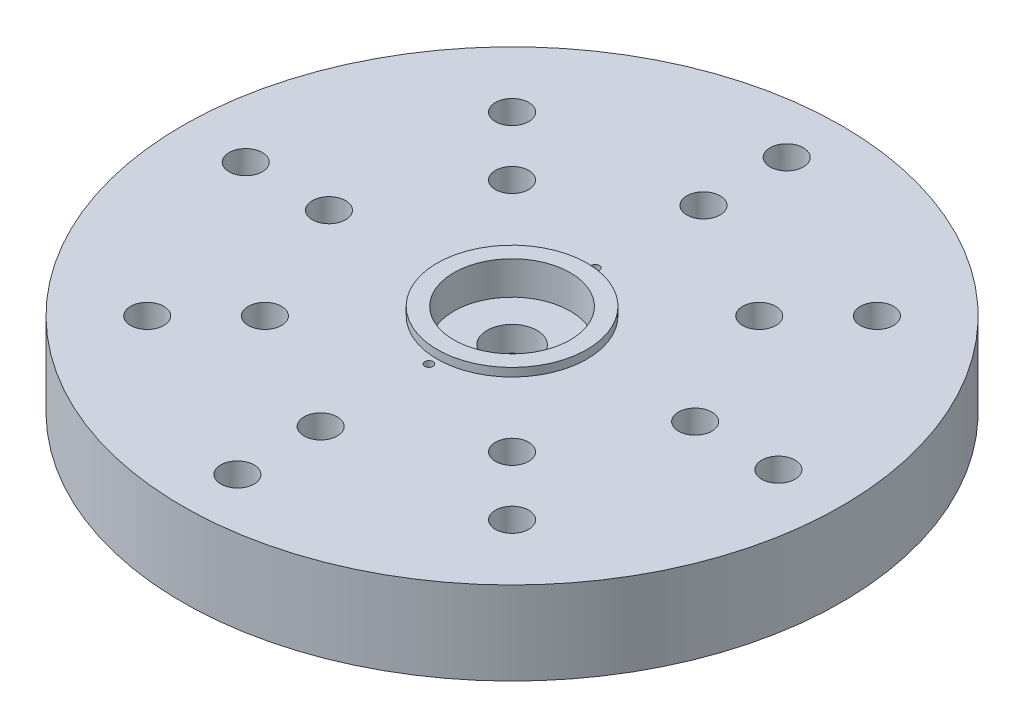
ISO-10303-21;
HEADER;
FILE_DESCRIPTION(('STEP AP214'),'2;1');
FILE_NAME('part.step','',(''),(''),'','','');
FILE_SCHEMA(('AUTOMOTIVE_DESIGN { 1 0 10303 214 1 1 1 1 }'));
ENDSEC;
DATA;
#1=APPLICATION_CONTEXT('core data for automotive mechanical design processes');
#2=APPLICATION_PROTOCOL_DEFINITION('international standard','automotive_design',2000,#1);
#3=PRODUCT_CONTEXT('',#1,'mechanical');
#4=PRODUCT('Part','Part','',(#3));
#5=PRODUCT_RELATED_PRODUCT_CATEGORY('part','',(#4));
#6=PRODUCT_DEFINITION_FORMATION('','',#4);
#7=PRODUCT_DEFINITION_CONTEXT('part definition',#1,'design');
#8=PRODUCT_DEFINITION('design','',#6,#7);
#9=PRODUCT_DEFINITION_SHAPE('','',#8);
#10=(LENGTH_UNIT() NAMED_UNIT(*) SI_UNIT(.MILLI.,.METRE.));
#11=(NAMED_UNIT(*) PLANE_ANGLE_UNIT() SI_UNIT($,.RADIAN.));
#12=(NAMED_UNIT(*) SI_UNIT($,.STERADIAN.) SOLID_ANGLE_UNIT());
#13=UNCERTAINTY_MEASURE_WITH_UNIT(LENGTH_MEASURE(1.E-05),#10,'distance_accuracy_value','');
#14=(GEOMETRIC_REPRESENTATION_CONTEXT(3) GLOBAL_UNCERTAINTY_ASSIGNED_CONTEXT((#13)) GLOBAL_UNIT_ASSIGNED_CONTEXT((#10,
#11,#12)) REPRESENTATION_CONTEXT('',''));
#15=CARTESIAN_POINT('',(0.,0.,0.));
#16=DIRECTION('',(0.,0.,1.));
#17=DIRECTION('',(1.,0.,0.));
#18=AXIS2_PLACEMENT_3D('',#15,#16,#17);
#19=CARTESIAN_POINT('',(6.,0.,0.));
#20=DIRECTION('',(0.,-1.,0.));
#21=DIRECTION('',(0.,0.,-1.));
#22=AXIS2_PLACEMENT_3D('',#19,#20,#21);
#23=PLANE('',#22);
#24=CARTESIAN_POINT('',(0.,0.,5.));
#25=DIRECTION('',(0.,-1.,0.));
#26=DIRECTION('',(0.,0.,-1.));
#27=AXIS2_PLACEMENT_3D('',#24,#25,#26);
#28=CIRCLE('',#27,0.25);
#29=CARTESIAN_POINT('',(0.,0.,4.75));
#30=VERTEX_POINT('',#29);
#31=EDGE_CURVE('E128',#30,#30,#28,.T.);
#32=ORIENTED_EDGE('',*,*,#31,.F.);
#33=EDGE_LOOP('',(#32));
#34=FACE_BOUND('',#33,.T.);
#35=CARTESIAN_POINT('',(0.,0.,-5.));
#36=DIRECTION('',(0.,-1.,0.));
#37=DIRECTION('',(0.,0.,-1.));
#38=AXIS2_PLACEMENT_3D('',#35,#36,#37);
#39=CIRCLE('',#38,0.25);
#40=CARTESIAN_POINT('',(0.,0.,-5.25));
#41=VERTEX_POINT('',#40);
#42=EDGE_CURVE('E149',#41,#41,#39,.T.);
#43=ORIENTED_EDGE('',*,*,#42,.F.);
#44=EDGE_LOOP('',(#43));
#45=FACE_BOUND('',#44,.T.);
#46=CARTESIAN_POINT('',(0.,0.,0.));
#47=DIRECTION('',(0.,-1.,0.));
#48=DIRECTION('',(0.,0.,-1.));
#49=AXIS2_PLACEMENT_3D('',#46,#47,#48);
#50=CIRCLE('',#49,6.);
#51=CARTESIAN_POINT('',(0.,0.,-6.));
#52=VERTEX_POINT('',#51);
#53=EDGE_CURVE('E50',#52,#52,#50,.T.);
#54=ORIENTED_EDGE('',*,*,#53,.T.);
#55=EDGE_LOOP('',(#54));
#56=FACE_BOUND('',#55,.T.);
#57=CARTESIAN_POINT('',(0.,0.,0.));
#58=DIRECTION('',(0.,-1.,0.));
#59=DIRECTION('',(0.,0.,-1.));
#60=AXIS2_PLACEMENT_3D('',#57,#58,#59);
#61=CIRCLE('',#60,4.);
#62=CARTESIAN_POINT('',(0.,0.,-4.));
#63=VERTEX_POINT('',#62);
#64=EDGE_CURVE('E10',#63,#63,#61,.T.);
#65=ORIENTED_EDGE('',*,*,#64,.F.);
#66=EDGE_LOOP('',(#65));
#67=FACE_BOUND('',#66,.T.);
#68=ADVANCED_FACE('F31',(#34,#45,#56,#67),#23,.T.);
#69=CARTESIAN_POINT('',(0.,0.,0.));
#70=DIRECTION('',(0.,-1.,0.));
#71=DIRECTION('',(0.,0.,-1.));
#72=AXIS2_PLACEMENT_3D('',#69,#70,#71);
#73=CYLINDRICAL_SURFACE('',#72,4.);
#74=ORIENTED_EDGE('',*,*,#64,.T.);
#75=EDGE_LOOP('',(#74));
#76=FACE_BOUND('',#75,.T.);
#77=CARTESIAN_POINT('',(0.,5.,0.));
#78=DIRECTION('',(0.,-1.,0.));
#79=DIRECTION('',(0.,0.,-1.));
#80=AXIS2_PLACEMENT_3D('',#77,#78,#79);
#81=CIRCLE('',#80,4.);
#82=CARTESIAN_POINT('',(0.,5.,-4.));
#83=VERTEX_POINT('',#82);
#84=EDGE_CURVE('E38',#83,#83,#81,.T.);
#85=ORIENTED_EDGE('',*,*,#84,.F.);
#86=EDGE_LOOP('',(#85));
#87=FACE_BOUND('',#86,.T.);
#88=ADVANCED_FACE('F189',(#76,#87),#73,.F.);
#89=CARTESIAN_POINT('',(4.,5.,0.));
#90=DIRECTION('',(0.,-1.,0.));
#91=DIRECTION('',(0.,0.,-1.));
#92=AXIS2_PLACEMENT_3D('',#89,#90,#91);
#93=PLANE('',#92);
#94=ORIENTED_EDGE('',*,*,#84,.T.);
#95=EDGE_LOOP('',(#94));
#96=FACE_BOUND('',#95,.T.);
#97=CARTESIAN_POINT('',(0.,5.,0.));
#98=DIRECTION('',(0.,-1.,0.));
#99=DIRECTION('',(0.,0.,-1.));
#100=AXIS2_PLACEMENT_3D('',#97,#98,#99);
#101=CIRCLE('',#100,1.5);
#102=CARTESIAN_POINT('',(0.,5.,-1.5));
#103=VERTEX_POINT('',#102);
#104=EDGE_CURVE('E43',#103,#103,#101,.T.);
#105=ORIENTED_EDGE('',*,*,#104,.F.);
#106=EDGE_LOOP('',(#105));
#107=FACE_BOUND('',#106,.T.);
#108=ADVANCED_FACE('F187',(#96,#107),#93,.T.);
#109=CARTESIAN_POINT('',(0.,0.,0.));
#110=DIRECTION('',(0.,-1.,0.));
#111=DIRECTION('',(0.,0.,-1.));
#112=AXIS2_PLACEMENT_3D('',#109,#110,#111);
#113=CYLINDRICAL_SURFACE('',#112,1.5);
#114=ORIENTED_EDGE('',*,*,#104,.T.);
#115=EDGE_LOOP('',(#114));
#116=FACE_BOUND('',#115,.T.);
#117=CARTESIAN_POINT('',(0.,6.5,0.));
#118=DIRECTION('',(0.,-1.,0.));
#119=DIRECTION('',(0.,0.,-1.));
#120=AXIS2_PLACEMENT_3D('',#117,#118,#119);
#121=CIRCLE('',#120,1.5);
#122=CARTESIAN_POINT('',(0.,6.5,-1.5));
#123=VERTEX_POINT('',#122);
#124=EDGE_CURVE('E179',#123,#123,#121,.T.);
#125=ORIENTED_EDGE('',*,*,#124,.F.);
#126=EDGE_LOOP('',(#125));
#127=FACE_BOUND('',#126,.T.);
#128=ADVANCED_FACE('F184',(#116,#127),#113,.F.);
#129=CARTESIAN_POINT('',(1.5,6.5,0.));
#130=DIRECTION('',(0.,1.,0.));
#131=DIRECTION('',(0.,0.,1.));
#132=AXIS2_PLACEMENT_3D('',#129,#130,#131);
#133=PLANE('',#132);
#134=ORIENTED_EDGE('',*,*,#124,.T.);
#135=EDGE_LOOP('',(#134));
#136=FACE_BOUND('',#135,.T.);
#137=CARTESIAN_POINT('',(0.,6.5,0.));
#138=DIRECTION('',(0.,-1.,0.));
#139=DIRECTION('',(0.,0.,-1.));
#140=AXIS2_PLACEMENT_3D('',#137,#138,#139);
#141=CIRCLE('',#140,3.5);
#142=CARTESIAN_POINT('',(0.,6.5,-3.5));
#143=VERTEX_POINT('',#142);
#144=EDGE_CURVE('E176',#143,#143,#141,.T.);
#145=ORIENTED_EDGE('',*,*,#144,.F.);
#146=EDGE_LOOP('',(#145));
#147=FACE_BOUND('',#146,.T.);
#148=ADVANCED_FACE('F196',(#136,#147),#133,.T.);
#149=CARTESIAN_POINT('',(0.,0.,0.));
#150=DIRECTION('',(0.,-1.,0.));
#151=DIRECTION('',(0.,0.,-1.));
#152=AXIS2_PLACEMENT_3D('',#149,#150,#151);
#153=CYLINDRICAL_SURFACE('',#152,3.5);
#154=ORIENTED_EDGE('',*,*,#144,.T.);
#155=EDGE_LOOP('',(#154));
#156=FACE_BOUND('',#155,.T.);
#157=CARTESIAN_POINT('',(0.,8.5,0.));
#158=DIRECTION('',(0.,-1.,0.));
#159=DIRECTION('',(0.,0.,-1.));
#160=AXIS2_PLACEMENT_3D('',#157,#158,#159);
#161=CIRCLE('',#160,3.5);
#162=CARTESIAN_POINT('',(0.,8.5,-3.5));
#163=VERTEX_POINT('',#162);
#164=EDGE_CURVE('E173',#163,#163,#161,.T.);
#165=ORIENTED_EDGE('',*,*,#164,.F.);
#166=EDGE_LOOP('',(#165));
#167=FACE_BOUND('',#166,.T.);
#168=ADVANCED_FACE('F241',(#156,#167),#153,.F.);
#169=CARTESIAN_POINT('',(3.5,8.5,0.));
#170=DIRECTION('',(0.,1.,0.));
#171=DIRECTION('',(0.,0.,1.));
#172=AXIS2_PLACEMENT_3D('',#169,#170,#171);
#173=PLANE('',#172);
#174=ORIENTED_EDGE('',*,*,#164,.T.);
#175=EDGE_LOOP('',(#174));
#176=FACE_BOUND('',#175,.T.);
#177=CARTESIAN_POINT('',(0.,8.5,0.));
#178=DIRECTION('',(0.,-1.,0.));
#179=DIRECTION('',(0.,0.,-1.));
#180=AXIS2_PLACEMENT_3D('',#177,#178,#179);
#181=CIRCLE('',#180,4.5);
#182=CARTESIAN_POINT('',(0.,8.5,-4.5));
#183=VERTEX_POINT('',#182);
#184=EDGE_CURVE('E170',#183,#183,#181,.T.);
#185=ORIENTED_EDGE('',*,*,#184,.F.);
#186=EDGE_LOOP('',(#185));
#187=FACE_BOUND('',#186,.T.);
#188=ADVANCED_FACE('F237',(#176,#187),#173,.T.);
#189=CARTESIAN_POINT('',(0.,0.,0.));
#190=DIRECTION('',(0.,-1.,0.));
#191=DIRECTION('',(0.,0.,-1.));
#192=AXIS2_PLACEMENT_3D('',#189,#190,#191);
#193=CYLINDRICAL_SURFACE('',#192,4.5);
#194=ORIENTED_EDGE('',*,*,#184,.T.);
#195=EDGE_LOOP('',(#194));
#196=FACE_BOUND('',#195,.T.);
#197=CARTESIAN_POINT('',(0.,8.,0.));
#198=DIRECTION('',(0.,-1.,0.));
#199=DIRECTION('',(0.,0.,-1.));
#200=AXIS2_PLACEMENT_3D('',#197,#198,#199);
#201=CIRCLE('',#200,4.5);
#202=CARTESIAN_POINT('',(0.,8.,-4.5));
#203=VERTEX_POINT('',#202);
#204=EDGE_CURVE('E167',#203,#203,#201,.T.);
#205=ORIENTED_EDGE('',*,*,#204,.F.);
#206=EDGE_LOOP('',(#205));
#207=FACE_BOUND('',#206,.T.);
#208=ADVANCED_FACE('F233',(#196,#207),#193,.T.);
#209=CARTESIAN_POINT('',(4.5,8.,0.));
#210=DIRECTION('',(0.,1.,0.));
#211=DIRECTION('',(0.,0.,1.));
#212=AXIS2_PLACEMENT_3D('',#209,#210,#211);
#213=PLANE('',#212);
#214=CARTESIAN_POINT('',(-7.07106781186546,8.,-7.07106781186549));
#215=DIRECTION('',(0.,1.,0.));
#216=DIRECTION('',(0.,0.,-1.));
#217=AXIS2_PLACEMENT_3D('',#214,#215,#216);
#218=CIRCLE('',#217,1.);
#219=CARTESIAN_POINT('',(-7.07106781186546,8.,-8.07106781186549));
#220=VERTEX_POINT('',#219);
#221=EDGE_CURVE('E117',#220,#220,#218,.T.);
#222=ORIENTED_EDGE('',*,*,#221,.F.);
#223=EDGE_LOOP('',(#222));
#224=FACE_BOUND('',#223,.T.);
#225=CARTESIAN_POINT('',(-10.6066017177982,8.,-10.6066017177982));
#226=DIRECTION('',(0.,1.,0.));
#227=DIRECTION('',(0.,0.,-1.));
#228=AXIS2_PLACEMENT_3D('',#225,#226,#227);
#229=CIRCLE('',#228,1.);
#230=CARTESIAN_POINT('',(-10.6066017177982,8.,-11.6066017177982));
#231=VERTEX_POINT('',#230);
#232=EDGE_CURVE('E107',#231,#231,#229,.T.);
#233=ORIENTED_EDGE('',*,*,#232,.F.);
#234=EDGE_LOOP('',(#233));
#235=FACE_BOUND('',#234,.T.);
#236=CARTESIAN_POINT('',(-16.,8.,0.));
#237=DIRECTION('',(0.,1.,0.));
#238=DIRECTION('',(0.,0.,-1.));
#239=AXIS2_PLACEMENT_3D('',#236,#237,#238);
#240=CIRCLE('',#239,1.);
#241=CARTESIAN_POINT('',(-16.,8.,-1.));
#242=VERTEX_POINT('',#241);
#243=EDGE_CURVE('E104',#242,#242,#240,.T.);
#244=ORIENTED_EDGE('',*,*,#243,.F.);
#245=EDGE_LOOP('',(#244));
#246=FACE_BOUND('',#245,.T.);
#247=CARTESIAN_POINT('',(-11.,8.,0.));
#248=DIRECTION('',(0.,1.,0.));
#249=DIRECTION('',(0.,0.,-1.));
#250=AXIS2_PLACEMENT_3D('',#247,#248,#249);
#251=CIRCLE('',#250,1.);
#252=CARTESIAN_POINT('',(-11.,8.,-1.));
#253=VERTEX_POINT('',#252);
#254=EDGE_CURVE('E101',#253,#253,#251,.T.);
#255=ORIENTED_EDGE('',*,*,#254,.F.);
#256=EDGE_LOOP('',(#255));
#257=FACE_BOUND('',#256,.T.);
#258=CARTESIAN_POINT('',(-10.9601551083915,8.,10.9601551083915));
#259=DIRECTION('',(0.,1.,0.));
#260=DIRECTION('',(0.,0.,-1.));
#261=AXIS2_PLACEMENT_3D('',#258,#259,#260);
#262=CIRCLE('',#261,1.);
#263=CARTESIAN_POINT('',(-10.9601551083915,8.,9.96015510839151));
#264=VERTEX_POINT('',#263);
#265=EDGE_CURVE('E97',#264,#264,#262,.T.);
#266=ORIENTED_EDGE('',*,*,#265,.F.);
#267=EDGE_LOOP('',(#266));
#268=FACE_BOUND('',#267,.T.);
#269=CARTESIAN_POINT('',(-7.42462120245874,8.,7.42462120245876));
#270=DIRECTION('',(0.,1.,0.));
#271=DIRECTION('',(0.,0.,-1.));
#272=AXIS2_PLACEMENT_3D('',#269,#270,#271);
#273=CIRCLE('',#272,1.);
#274=CARTESIAN_POINT('',(-7.42462120245874,8.,6.42462120245876));
#275=VERTEX_POINT('',#274);
#276=EDGE_CURVE('E93',#275,#275,#273,.T.);
#277=ORIENTED_EDGE('',*,*,#276,.F.);
#278=EDGE_LOOP('',(#277));
#279=FACE_BOUND('',#278,.T.);
#280=CARTESIAN_POINT('',(0.,8.,5.));
#281=DIRECTION('',(0.,1.,0.));
#282=DIRECTION('',(0.,0.,-1.));
#283=AXIS2_PLACEMENT_3D('',#280,#281,#282);
#284=CIRCLE('',#283,0.25);
#285=CARTESIAN_POINT('',(0.,8.,4.75));
#286=VERTEX_POINT('',#285);
#287=EDGE_CURVE('E92',#286,#286,#284,.T.);
#288=ORIENTED_EDGE('',*,*,#287,.F.);
#289=EDGE_LOOP('',(#288));
#290=FACE_BOUND('',#289,.T.);
#291=CARTESIAN_POINT('',(0.,8.,11.5));
#292=DIRECTION('',(0.,1.,0.));
#293=DIRECTION('',(0.,0.,-1.));
#294=AXIS2_PLACEMENT_3D('',#291,#292,#293);
#295=CIRCLE('',#294,1.);
#296=CARTESIAN_POINT('',(0.,8.,10.5));
#297=VERTEX_POINT('',#296);
#298=EDGE_CURVE('E88',#297,#297,#295,.T.);
#299=ORIENTED_EDGE('',*,*,#298,.F.);
#300=EDGE_LOOP('',(#299));
#301=FACE_BOUND('',#300,.T.);
#302=CARTESIAN_POINT('',(0.,8.,16.5));
#303=DIRECTION('',(0.,1.,0.));
#304=DIRECTION('',(0.,0.,-1.));
#305=AXIS2_PLACEMENT_3D('',#302,#303,#304);
#306=CIRCLE('',#305,1.);
#307=CARTESIAN_POINT('',(0.,8.,15.5));
#308=VERTEX_POINT('',#307);
#309=EDGE_CURVE('E84',#308,#308,#306,.T.);
#310=ORIENTED_EDGE('',*,*,#309,.F.);
#311=EDGE_LOOP('',(#310));
#312=FACE_BOUND('',#311,.T.);
#313=CARTESIAN_POINT('',(7.07106781186546,8.,7.07106781186549));
#314=DIRECTION('',(0.,1.,0.));
#315=DIRECTION('',(0.,0.,1.));
#316=AXIS2_PLACEMENT_3D('',#313,#314,#315);
#317=CIRCLE('',#316,1.);
#318=CARTESIAN_POINT('',(7.07106781186546,8.,8.07106781186549));
#319=VERTEX_POINT('',#318);
#320=EDGE_CURVE('E80',#319,#319,#317,.T.);
#321=ORIENTED_EDGE('',*,*,#320,.F.);
#322=EDGE_LOOP('',(#321));
#323=FACE_BOUND('',#322,.T.);
#324=CARTESIAN_POINT('',(10.6066017177982,8.,10.6066017177982));
#325=DIRECTION('',(0.,1.,0.));
#326=DIRECTION('',(0.,0.,1.));
#327=AXIS2_PLACEMENT_3D('',#324,#325,#326);
#328=CIRCLE('',#327,1.);
#329=CARTESIAN_POINT('',(10.6066017177982,8.,11.6066017177982));
#330=VERTEX_POINT('',#329);
#331=EDGE_CURVE('E76',#330,#330,#328,.T.);
#332=ORIENTED_EDGE('',*,*,#331,.F.);
#333=EDGE_LOOP('',(#332));
#334=FACE_BOUND('',#333,.T.);
#335=CARTESIAN_POINT('',(16.,8.,0.));
#336=DIRECTION('',(0.,1.,0.));
#337=DIRECTION('',(0.,0.,1.));
#338=AXIS2_PLACEMENT_3D('',#335,#336,#337);
#339=CIRCLE('',#338,1.);
#340=CARTESIAN_POINT('',(16.,8.,1.));
#341=VERTEX_POINT('',#340);
#342=EDGE_CURVE('E72',#341,#341,#339,.T.);
#343=ORIENTED_EDGE('',*,*,#342,.F.);
#344=EDGE_LOOP('',(#343));
#345=FACE_BOUND('',#344,.T.);
#346=CARTESIAN_POINT('',(11.,8.,0.));
#347=DIRECTION('',(0.,1.,0.));
#348=DIRECTION('',(0.,0.,1.));
#349=AXIS2_PLACEMENT_3D('',#346,#347,#348);
#350=CIRCLE('',#349,1.);
#351=CARTESIAN_POINT('',(11.,8.,1.));
#352=VERTEX_POINT('',#351);
#353=EDGE_CURVE('E68',#352,#352,#350,.T.);
#354=ORIENTED_EDGE('',*,*,#353,.F.);
#355=EDGE_LOOP('',(#354));
#356=FACE_BOUND('',#355,.T.);
#357=CARTESIAN_POINT('',(10.9601551083915,8.,-10.9601551083915));
#358=DIRECTION('',(0.,1.,0.));
#359=DIRECTION('',(0.,0.,1.));
#360=AXIS2_PLACEMENT_3D('',#357,#358,#359);
#361=CIRCLE('',#360,1.);
#362=CARTESIAN_POINT('',(10.9601551083915,8.,-9.96015510839151));
#363=VERTEX_POINT('',#362);
#364=EDGE_CURVE('E64',#363,#363,#361,.T.);
#365=ORIENTED_EDGE('',*,*,#364,.F.);
#366=EDGE_LOOP('',(#365));
#367=FACE_BOUND('',#366,.T.);
#368=CARTESIAN_POINT('',(7.42462120245874,8.,-7.42462120245876));
#369=DIRECTION('',(0.,1.,0.));
#370=DIRECTION('',(0.,0.,1.));
#371=AXIS2_PLACEMENT_3D('',#368,#369,#370);
#372=CIRCLE('',#371,1.);
#373=CARTESIAN_POINT('',(7.42462120245874,8.,-6.42462120245876));
#374=VERTEX_POINT('',#373);
#375=EDGE_CURVE('E60',#374,#374,#372,.T.);
#376=ORIENTED_EDGE('',*,*,#375,.F.);
#377=EDGE_LOOP('',(#376));
#378=FACE_BOUND('',#377,.T.);
#379=CARTESIAN_POINT('',(0.,8.,-5.));
#380=DIRECTION('',(0.,1.,0.));
#381=DIRECTION('',(0.,0.,1.));
#382=AXIS2_PLACEMENT_3D('',#379,#380,#381);
#383=CIRCLE('',#382,0.25);
#384=CARTESIAN_POINT('',(0.,8.,-4.75));
#385=VERTEX_POINT('',#384);
#386=EDGE_CURVE('E59',#385,#385,#383,.T.);
#387=ORIENTED_EDGE('',*,*,#386,.F.);
#388=EDGE_LOOP('',(#387));
#389=FACE_BOUND('',#388,.T.);
#390=CARTESIAN_POINT('',(0.,8.,-11.5));
#391=DIRECTION('',(0.,1.,0.));
#392=DIRECTION('',(0.,0.,1.));
#393=AXIS2_PLACEMENT_3D('',#390,#391,#392);
#394=CIRCLE('',#393,1.);
#395=CARTESIAN_POINT('',(0.,8.,-10.5));
#396=VERTEX_POINT('',#395);
#397=EDGE_CURVE('E55',#396,#396,#394,.T.);
#398=ORIENTED_EDGE('',*,*,#397,.F.);
#399=EDGE_LOOP('',(#398));
#400=FACE_BOUND('',#399,.T.);
#401=CARTESIAN_POINT('',(0.,8.,-16.5));
#402=DIRECTION('',(0.,1.,0.));
#403=DIRECTION('',(0.,0.,1.));
#404=AXIS2_PLACEMENT_3D('',#401,#402,#403);
#405=CIRCLE('',#404,1.);
#406=CARTESIAN_POINT('',(0.,8.,-15.5));
#407=VERTEX_POINT('',#406);
#408=EDGE_CURVE('E51',#407,#407,#405,.T.);
#409=ORIENTED_EDGE('',*,*,#408,.F.);
#410=EDGE_LOOP('',(#409));
#411=FACE_BOUND('',#410,.T.);
#412=ORIENTED_EDGE('',*,*,#204,.T.);
#413=EDGE_LOOP('',(#412));
#414=FACE_BOUND('',#413,.T.);
#415=CARTESIAN_POINT('',(0.,8.,0.));
#416=DIRECTION('',(0.,-1.,0.));
#417=DIRECTION('',(0.,0.,-1.));
#418=AXIS2_PLACEMENT_3D('',#415,#416,#417);
#419=CIRCLE('',#418,19.8);
#420=CARTESIAN_POINT('',(0.,8.,-19.8));
#421=VERTEX_POINT('',#420);
#422=EDGE_CURVE('E164',#421,#421,#419,.T.);
#423=ORIENTED_EDGE('',*,*,#422,.F.);
#424=EDGE_LOOP('',(#423));
#425=FACE_BOUND('',#424,.T.);
#426=ADVANCED_FACE('F229',(#224,#235,#246,#257,#268,#279,#290,#301,#312,#323,#334,#345,#356,
#367,#378,#389,#400,#411,#414,#425),#213,.T.);
#427=CARTESIAN_POINT('',(0.,0.,0.));
#428=DIRECTION('',(0.,-1.,0.));
#429=DIRECTION('',(0.,0.,-1.));
#430=AXIS2_PLACEMENT_3D('',#427,#428,#429);
#431=CYLINDRICAL_SURFACE('',#430,19.8);
#432=ORIENTED_EDGE('',*,*,#422,.T.);
#433=EDGE_LOOP('',(#432));
#434=FACE_BOUND('',#433,.T.);
#435=CARTESIAN_POINT('',(0.,3.,0.));
#436=DIRECTION('',(0.,-1.,0.));
#437=DIRECTION('',(0.,0.,-1.));
#438=AXIS2_PLACEMENT_3D('',#435,#436,#437);
#439=CIRCLE('',#438,19.8);
#440=CARTESIAN_POINT('',(0.,3.,-19.8));
#441=VERTEX_POINT('',#440);
#442=EDGE_CURVE('E161',#441,#441,#439,.T.);
#443=ORIENTED_EDGE('',*,*,#442,.F.);
#444=EDGE_LOOP('',(#443));
#445=FACE_BOUND('',#444,.T.);
#446=ADVANCED_FACE('F222',(#434,#445),#431,.T.);
#447=CARTESIAN_POINT('',(19.8,3.,0.));
#448=DIRECTION('',(0.,-1.,0.));
#449=DIRECTION('',(0.,0.,-1.));
#450=AXIS2_PLACEMENT_3D('',#447,#448,#449);
#451=PLANE('',#450);
#452=CARTESIAN_POINT('',(-7.07106781186546,3.,-7.07106781186549));
#453=DIRECTION('',(0.,-1.,0.));
#454=DIRECTION('',(0.,0.,-1.));
#455=AXIS2_PLACEMENT_3D('',#452,#453,#454);
#456=CIRCLE('',#455,1.);
#457=CARTESIAN_POINT('',(-7.07106781186546,3.,-8.07106781186549));
#458=VERTEX_POINT('',#457);
#459=EDGE_CURVE('E34',#458,#458,#456,.T.);
#460=ORIENTED_EDGE('',*,*,#459,.F.);
#461=EDGE_LOOP('',(#460));
#462=FACE_BOUND('',#461,.T.);
#463=CARTESIAN_POINT('',(-10.6066017177982,3.,-10.6066017177982));
#464=DIRECTION('',(0.,-1.,0.));
#465=DIRECTION('',(0.,0.,-1.));
#466=AXIS2_PLACEMENT_3D('',#463,#464,#465);
#467=CIRCLE('',#466,1.);
#468=CARTESIAN_POINT('',(-10.6066017177982,3.,-11.6066017177982));
#469=VERTEX_POINT('',#468);
#470=EDGE_CURVE('E105',#469,#469,#467,.T.);
#471=ORIENTED_EDGE('',*,*,#470,.F.);
#472=EDGE_LOOP('',(#471));
#473=FACE_BOUND('',#472,.T.);
#474=CARTESIAN_POINT('',(-16.,3.,0.));
#475=DIRECTION('',(0.,-1.,0.));
#476=DIRECTION('',(0.,0.,-1.));
#477=AXIS2_PLACEMENT_3D('',#474,#475,#476);
#478=CIRCLE('',#477,1.);
#479=CARTESIAN_POINT('',(-16.,3.,-1.));
#480=VERTEX_POINT('',#479);
#481=EDGE_CURVE('E102',#480,#480,#478,.T.);
#482=ORIENTED_EDGE('',*,*,#481,.F.);
#483=EDGE_LOOP('',(#482));
#484=FACE_BOUND('',#483,.T.);
#485=CARTESIAN_POINT('',(-11.,3.,0.));
#486=DIRECTION('',(0.,-1.,0.));
#487=DIRECTION('',(0.,0.,-1.));
#488=AXIS2_PLACEMENT_3D('',#485,#486,#487);
#489=CIRCLE('',#488,1.);
#490=CARTESIAN_POINT('',(-11.,3.,-1.));
#491=VERTEX_POINT('',#490);
#492=EDGE_CURVE('E98',#491,#491,#489,.T.);
#493=ORIENTED_EDGE('',*,*,#492,.F.);
#494=EDGE_LOOP('',(#493));
#495=FACE_BOUND('',#494,.T.);
#496=CARTESIAN_POINT('',(-10.9601551083915,3.,10.9601551083915));
#497=DIRECTION('',(0.,-1.,0.));
#498=DIRECTION('',(0.,0.,-1.));
#499=AXIS2_PLACEMENT_3D('',#496,#497,#498);
#500=CIRCLE('',#499,1.);
#501=CARTESIAN_POINT('',(-10.9601551083915,3.,9.96015510839151));
#502=VERTEX_POINT('',#501);
#503=EDGE_CURVE('E94',#502,#502,#500,.T.);
#504=ORIENTED_EDGE('',*,*,#503,.F.);
#505=EDGE_LOOP('',(#504));
#506=FACE_BOUND('',#505,.T.);
#507=CARTESIAN_POINT('',(-7.42462120245874,3.,7.42462120245876));
#508=DIRECTION('',(0.,-1.,0.));
#509=DIRECTION('',(0.,0.,-1.));
#510=AXIS2_PLACEMENT_3D('',#507,#508,#509);
#511=CIRCLE('',#510,1.);
#512=CARTESIAN_POINT('',(-7.42462120245874,3.,6.42462120245876));
#513=VERTEX_POINT('',#512);
#514=EDGE_CURVE('E89',#513,#513,#511,.T.);
#515=ORIENTED_EDGE('',*,*,#514,.F.);
#516=EDGE_LOOP('',(#515));
#517=FACE_BOUND('',#516,.T.);
#518=CARTESIAN_POINT('',(0.,3.,11.5));
#519=DIRECTION('',(0.,-1.,0.));
#520=DIRECTION('',(0.,0.,-1.));
#521=AXIS2_PLACEMENT_3D('',#518,#519,#520);
#522=CIRCLE('',#521,1.);
#523=CARTESIAN_POINT('',(0.,3.,10.5));
#524=VERTEX_POINT('',#523);
#525=EDGE_CURVE('E85',#524,#524,#522,.T.);
#526=ORIENTED_EDGE('',*,*,#525,.F.);
#527=EDGE_LOOP('',(#526));
#528=FACE_BOUND('',#527,.T.);
#529=CARTESIAN_POINT('',(0.,3.,16.5));
#530=DIRECTION('',(0.,-1.,0.));
#531=DIRECTION('',(0.,0.,-1.));
#532=AXIS2_PLACEMENT_3D('',#529,#530,#531);
#533=CIRCLE('',#532,1.);
#534=CARTESIAN_POINT('',(0.,3.,15.5));
#535=VERTEX_POINT('',#534);
#536=EDGE_CURVE('E81',#535,#535,#533,.T.);
#537=ORIENTED_EDGE('',*,*,#536,.F.);
#538=EDGE_LOOP('',(#537));
#539=FACE_BOUND('',#538,.T.);
#540=CARTESIAN_POINT('',(7.07106781186546,3.,7.07106781186549));
#541=DIRECTION('',(0.,-1.,0.));
#542=DIRECTION('',(0.,0.,-1.));
#543=AXIS2_PLACEMENT_3D('',#540,#541,#542);
#544=CIRCLE('',#543,1.);
#545=CARTESIAN_POINT('',(7.07106781186546,3.,6.07106781186549));
#546=VERTEX_POINT('',#545);
#547=EDGE_CURVE('E77',#546,#546,#544,.T.);
#548=ORIENTED_EDGE('',*,*,#547,.F.);
#549=EDGE_LOOP('',(#548));
#550=FACE_BOUND('',#549,.T.);
#551=CARTESIAN_POINT('',(10.6066017177982,3.,10.6066017177982));
#552=DIRECTION('',(0.,-1.,0.));
#553=DIRECTION('',(0.,0.,-1.));
#554=AXIS2_PLACEMENT_3D('',#551,#552,#553);
#555=CIRCLE('',#554,1.);
#556=CARTESIAN_POINT('',(10.6066017177982,3.,9.60660171779823));
#557=VERTEX_POINT('',#556);
#558=EDGE_CURVE('E73',#557,#557,#555,.T.);
#559=ORIENTED_EDGE('',*,*,#558,.F.);
#560=EDGE_LOOP('',(#559));
#561=FACE_BOUND('',#560,.T.);
#562=CARTESIAN_POINT('',(16.,3.,0.));
#563=DIRECTION('',(0.,-1.,0.));
#564=DIRECTION('',(0.,0.,-1.));
#565=AXIS2_PLACEMENT_3D('',#562,#563,#564);
#566=CIRCLE('',#565,1.);
#567=CARTESIAN_POINT('',(16.,3.,-1.));
#568=VERTEX_POINT('',#567);
#569=EDGE_CURVE('E69',#568,#568,#566,.T.);
#570=ORIENTED_EDGE('',*,*,#569,.F.);
#571=EDGE_LOOP('',(#570));
#572=FACE_BOUND('',#571,.T.);
#573=CARTESIAN_POINT('',(11.,3.,0.));
#574=DIRECTION('',(0.,-1.,0.));
#575=DIRECTION('',(0.,0.,-1.));
#576=AXIS2_PLACEMENT_3D('',#573,#574,#575);
#577=CIRCLE('',#576,1.);
#578=CARTESIAN_POINT('',(11.,3.,-1.));
#579=VERTEX_POINT('',#578);
#580=EDGE_CURVE('E65',#579,#579,#577,.T.);
#581=ORIENTED_EDGE('',*,*,#580,.F.);
#582=EDGE_LOOP('',(#581));
#583=FACE_BOUND('',#582,.T.);
#584=CARTESIAN_POINT('',(10.9601551083915,3.,-10.9601551083915));
#585=DIRECTION('',(0.,-1.,0.));
#586=DIRECTION('',(0.,0.,-1.));
#587=AXIS2_PLACEMENT_3D('',#584,#585,#586);
#588=CIRCLE('',#587,1.);
#589=CARTESIAN_POINT('',(10.9601551083915,3.,-11.9601551083915));
#590=VERTEX_POINT('',#589);
#591=EDGE_CURVE('E61',#590,#590,#588,.T.);
#592=ORIENTED_EDGE('',*,*,#591,.F.);
#593=EDGE_LOOP('',(#592));
#594=FACE_BOUND('',#593,.T.);
#595=CARTESIAN_POINT('',(7.42462120245874,3.,-7.42462120245876));
#596=DIRECTION('',(0.,-1.,0.));
#597=DIRECTION('',(0.,0.,-1.));
#598=AXIS2_PLACEMENT_3D('',#595,#596,#597);
#599=CIRCLE('',#598,1.);
#600=CARTESIAN_POINT('',(7.42462120245874,3.,-8.42462120245876));
#601=VERTEX_POINT('',#600);
#602=EDGE_CURVE('E56',#601,#601,#599,.T.);
#603=ORIENTED_EDGE('',*,*,#602,.F.);
#604=EDGE_LOOP('',(#603));
#605=FACE_BOUND('',#604,.T.);
#606=CARTESIAN_POINT('',(0.,3.,-11.5));
#607=DIRECTION('',(0.,-1.,0.));
#608=DIRECTION('',(0.,0.,-1.));
#609=AXIS2_PLACEMENT_3D('',#606,#607,#608);
#610=CIRCLE('',#609,1.);
#611=CARTESIAN_POINT('',(0.,3.,-12.5));
#612=VERTEX_POINT('',#611);
#613=EDGE_CURVE('E52',#612,#612,#610,.T.);
#614=ORIENTED_EDGE('',*,*,#613,.F.);
#615=EDGE_LOOP('',(#614));
#616=FACE_BOUND('',#615,.T.);
#617=CARTESIAN_POINT('',(0.,3.,-16.5));
#618=DIRECTION('',(0.,-1.,0.));
#619=DIRECTION('',(0.,0.,-1.));
#620=AXIS2_PLACEMENT_3D('',#617,#618,#619);
#621=CIRCLE('',#620,1.);
#622=CARTESIAN_POINT('',(0.,3.,-17.5));
#623=VERTEX_POINT('',#622);
#624=EDGE_CURVE('E47',#623,#623,#621,.T.);
#625=ORIENTED_EDGE('',*,*,#624,.F.);
#626=EDGE_LOOP('',(#625));
#627=FACE_BOUND('',#626,.T.);
#628=ORIENTED_EDGE('',*,*,#442,.T.);
#629=EDGE_LOOP('',(#628));
#630=FACE_BOUND('',#629,.T.);
#631=CARTESIAN_POINT('',(0.,3.,0.));
#632=DIRECTION('',(0.,-1.,0.));
#633=DIRECTION('',(0.,0.,-1.));
#634=AXIS2_PLACEMENT_3D('',#631,#632,#633);
#635=CIRCLE('',#634,6.);
#636=CARTESIAN_POINT('',(0.,3.,-6.));
#637=VERTEX_POINT('',#636);
#638=EDGE_CURVE('E158',#637,#637,#635,.T.);
#639=ORIENTED_EDGE('',*,*,#638,.F.);
#640=EDGE_LOOP('',(#639));
#641=FACE_BOUND('',#640,.T.);
#642=ADVANCED_FACE('F212',(#462,#473,#484,#495,#506,#517,#528,#539,#550,#561,#572,#583,#594,
#605,#616,#627,#630,#641),#451,.T.);
#643=CARTESIAN_POINT('',(0.,0.,0.));
#644=DIRECTION('',(0.,-1.,0.));
#645=DIRECTION('',(0.,0.,-1.));
#646=AXIS2_PLACEMENT_3D('',#643,#644,#645);
#647=CYLINDRICAL_SURFACE('',#646,6.);
#648=ORIENTED_EDGE('',*,*,#638,.T.);
#649=EDGE_LOOP('',(#648));
#650=FACE_BOUND('',#649,.T.);
#651=ORIENTED_EDGE('',*,*,#53,.F.);
#652=EDGE_LOOP('',(#651));
#653=FACE_BOUND('',#652,.T.);
#654=ADVANCED_FACE('F209',(#650,#653),#647,.T.);
#655=CARTESIAN_POINT('',(0.,-2.,-16.5));
#656=DIRECTION('',(0.,1.,0.));
#657=DIRECTION('',(0.,0.,1.));
#658=AXIS2_PLACEMENT_3D('',#655,#656,#657);
#659=CYLINDRICAL_SURFACE('',#658,1.);
#660=ORIENTED_EDGE('',*,*,#624,.T.);
#661=EDGE_LOOP('',(#660));
#662=FACE_BOUND('',#661,.T.);
#663=ORIENTED_EDGE('',*,*,#408,.T.);
#664=EDGE_LOOP('',(#663));
#665=FACE_BOUND('',#664,.T.);
#666=ADVANCED_FACE('F211',(#662,#665),#659,.F.);
#667=CARTESIAN_POINT('',(0.,-2.,-11.5));
#668=DIRECTION('',(0.,1.,0.));
#669=DIRECTION('',(0.,0.,1.));
#670=AXIS2_PLACEMENT_3D('',#667,#668,#669);
#671=CYLINDRICAL_SURFACE('',#670,1.);
#672=ORIENTED_EDGE('',*,*,#613,.T.);
#673=EDGE_LOOP('',(#672));
#674=FACE_BOUND('',#673,.T.);
#675=ORIENTED_EDGE('',*,*,#397,.T.);
#676=EDGE_LOOP('',(#675));
#677=FACE_BOUND('',#676,.T.);
#678=ADVANCED_FACE('F219',(#674,#677),#671,.F.);
#679=CARTESIAN_POINT('',(0.,-2.,-5.));
#680=DIRECTION('',(0.,1.,0.));
#681=DIRECTION('',(0.,0.,1.));
#682=AXIS2_PLACEMENT_3D('',#679,#680,#681);
#683=CYLINDRICAL_SURFACE('',#682,0.25);
#684=ORIENTED_EDGE('',*,*,#42,.T.);
#685=EDGE_LOOP('',(#684));
#686=FACE_BOUND('',#685,.T.);
#687=ORIENTED_EDGE('',*,*,#386,.T.);
#688=EDGE_LOOP('',(#687));
#689=FACE_BOUND('',#688,.T.);
#690=ADVANCED_FACE('F413',(#686,#689),#683,.F.);
#691=CARTESIAN_POINT('',(7.42462120245874,-2.,-7.42462120245876));
#692=DIRECTION('',(0.,1.,0.));
#693=DIRECTION('',(0.,0.,1.));
#694=AXIS2_PLACEMENT_3D('',#691,#692,#693);
#695=CYLINDRICAL_SURFACE('',#694,1.);
#696=ORIENTED_EDGE('',*,*,#602,.T.);
#697=EDGE_LOOP('',(#696));
#698=FACE_BOUND('',#697,.T.);
#699=ORIENTED_EDGE('',*,*,#375,.T.);
#700=EDGE_LOOP('',(#699));
#701=FACE_BOUND('',#700,.T.);
#702=ADVANCED_FACE('F409',(#698,#701),#695,.F.);
#703=CARTESIAN_POINT('',(10.9601551083915,-2.,-10.9601551083915));
#704=DIRECTION('',(0.,1.,0.));
#705=DIRECTION('',(0.,0.,1.));
#706=AXIS2_PLACEMENT_3D('',#703,#704,#705);
#707=CYLINDRICAL_SURFACE('',#706,1.);
#708=ORIENTED_EDGE('',*,*,#591,.T.);
#709=EDGE_LOOP('',(#708));
#710=FACE_BOUND('',#709,.T.);
#711=ORIENTED_EDGE('',*,*,#364,.T.);
#712=EDGE_LOOP('',(#711));
#713=FACE_BOUND('',#712,.T.);
#714=ADVANCED_FACE('F405',(#710,#713),#707,.F.);
#715=CARTESIAN_POINT('',(11.,-2.,0.));
#716=DIRECTION('',(0.,1.,0.));
#717=DIRECTION('',(0.,0.,1.));
#718=AXIS2_PLACEMENT_3D('',#715,#716,#717);
#719=CYLINDRICAL_SURFACE('',#718,1.);
#720=ORIENTED_EDGE('',*,*,#580,.T.);
#721=EDGE_LOOP('',(#720));
#722=FACE_BOUND('',#721,.T.);
#723=ORIENTED_EDGE('',*,*,#353,.T.);
#724=EDGE_LOOP('',(#723));
#725=FACE_BOUND('',#724,.T.);
#726=ADVANCED_FACE('F401',(#722,#725),#719,.F.);
#727=CARTESIAN_POINT('',(16.,-2.,0.));
#728=DIRECTION('',(0.,1.,0.));
#729=DIRECTION('',(0.,0.,1.));
#730=AXIS2_PLACEMENT_3D('',#727,#728,#729);
#731=CYLINDRICAL_SURFACE('',#730,1.);
#732=ORIENTED_EDGE('',*,*,#569,.T.);
#733=EDGE_LOOP('',(#732));
#734=FACE_BOUND('',#733,.T.);
#735=ORIENTED_EDGE('',*,*,#342,.T.);
#736=EDGE_LOOP('',(#735));
#737=FACE_BOUND('',#736,.T.);
#738=ADVANCED_FACE('F397',(#734,#737),#731,.F.);
#739=CARTESIAN_POINT('',(10.6066017177982,-2.,10.6066017177982));
#740=DIRECTION('',(0.,1.,0.));
#741=DIRECTION('',(0.,0.,1.));
#742=AXIS2_PLACEMENT_3D('',#739,#740,#741);
#743=CYLINDRICAL_SURFACE('',#742,1.);
#744=ORIENTED_EDGE('',*,*,#558,.T.);
#745=EDGE_LOOP('',(#744));
#746=FACE_BOUND('',#745,.T.);
#747=ORIENTED_EDGE('',*,*,#331,.T.);
#748=EDGE_LOOP('',(#747));
#749=FACE_BOUND('',#748,.T.);
#750=ADVANCED_FACE('F393',(#746,#749),#743,.F.);
#751=CARTESIAN_POINT('',(7.07106781186546,-2.,7.07106781186549));
#752=DIRECTION('',(0.,1.,0.));
#753=DIRECTION('',(0.,0.,1.));
#754=AXIS2_PLACEMENT_3D('',#751,#752,#753);
#755=CYLINDRICAL_SURFACE('',#754,1.);
#756=ORIENTED_EDGE('',*,*,#547,.T.);
#757=EDGE_LOOP('',(#756));
#758=FACE_BOUND('',#757,.T.);
#759=ORIENTED_EDGE('',*,*,#320,.T.);
#760=EDGE_LOOP('',(#759));
#761=FACE_BOUND('',#760,.T.);
#762=ADVANCED_FACE('F305',(#758,#761),#755,.F.);
#763=CARTESIAN_POINT('',(0.,-2.,16.5));
#764=DIRECTION('',(0.,1.,0.));
#765=DIRECTION('',(0.,0.,1.));
#766=AXIS2_PLACEMENT_3D('',#763,#764,#765);
#767=CYLINDRICAL_SURFACE('',#766,1.);
#768=ORIENTED_EDGE('',*,*,#536,.T.);
#769=EDGE_LOOP('',(#768));
#770=FACE_BOUND('',#769,.T.);
#771=ORIENTED_EDGE('',*,*,#309,.T.);
#772=EDGE_LOOP('',(#771));
#773=FACE_BOUND('',#772,.T.);
#774=ADVANCED_FACE('F299',(#770,#773),#767,.F.);
#775=CARTESIAN_POINT('',(0.,-2.,11.5));
#776=DIRECTION('',(0.,1.,0.));
#777=DIRECTION('',(0.,0.,1.));
#778=AXIS2_PLACEMENT_3D('',#775,#776,#777);
#779=CYLINDRICAL_SURFACE('',#778,1.);
#780=ORIENTED_EDGE('',*,*,#525,.T.);
#781=EDGE_LOOP('',(#780));
#782=FACE_BOUND('',#781,.T.);
#783=ORIENTED_EDGE('',*,*,#298,.T.);
#784=EDGE_LOOP('',(#783));
#785=FACE_BOUND('',#784,.T.);
#786=ADVANCED_FACE('F304',(#782,#785),#779,.F.);
#787=CARTESIAN_POINT('',(0.,-2.,5.));
#788=DIRECTION('',(0.,1.,0.));
#789=DIRECTION('',(0.,0.,1.));
#790=AXIS2_PLACEMENT_3D('',#787,#788,#789);
#791=CYLINDRICAL_SURFACE('',#790,0.25);
#792=ORIENTED_EDGE('',*,*,#31,.T.);
#793=EDGE_LOOP('',(#792));
#794=FACE_BOUND('',#793,.T.);
#795=ORIENTED_EDGE('',*,*,#287,.T.);
#796=EDGE_LOOP('',(#795));
#797=FACE_BOUND('',#796,.T.);
#798=ADVANCED_FACE('F317',(#794,#797),#791,.F.);
#799=CARTESIAN_POINT('',(-7.42462120245874,-2.,7.42462120245876));
#800=DIRECTION('',(0.,1.,0.));
#801=DIRECTION('',(0.,0.,1.));
#802=AXIS2_PLACEMENT_3D('',#799,#800,#801);
#803=CYLINDRICAL_SURFACE('',#802,1.);
#804=ORIENTED_EDGE('',*,*,#514,.T.);
#805=EDGE_LOOP('',(#804));
#806=FACE_BOUND('',#805,.T.);
#807=ORIENTED_EDGE('',*,*,#276,.T.);
#808=EDGE_LOOP('',(#807));
#809=FACE_BOUND('',#808,.T.);
#810=ADVANCED_FACE('F327',(#806,#809),#803,.F.);
#811=CARTESIAN_POINT('',(-10.9601551083915,-2.,10.9601551083915));
#812=DIRECTION('',(0.,1.,0.));
#813=DIRECTION('',(0.,0.,1.));
#814=AXIS2_PLACEMENT_3D('',#811,#812,#813);
#815=CYLINDRICAL_SURFACE('',#814,1.);
#816=ORIENTED_EDGE('',*,*,#503,.T.);
#817=EDGE_LOOP('',(#816));
#818=FACE_BOUND('',#817,.T.);
#819=ORIENTED_EDGE('',*,*,#265,.T.);
#820=EDGE_LOOP('',(#819));
#821=FACE_BOUND('',#820,.T.);
#822=ADVANCED_FACE('F337',(#818,#821),#815,.F.);
#823=CARTESIAN_POINT('',(-11.,-2.,0.));
#824=DIRECTION('',(0.,1.,0.));
#825=DIRECTION('',(0.,0.,1.));
#826=AXIS2_PLACEMENT_3D('',#823,#824,#825);
#827=CYLINDRICAL_SURFACE('',#826,1.);
#828=ORIENTED_EDGE('',*,*,#492,.T.);
#829=EDGE_LOOP('',(#828));
#830=FACE_BOUND('',#829,.T.);
#831=ORIENTED_EDGE('',*,*,#254,.T.);
#832=EDGE_LOOP('',(#831));
#833=FACE_BOUND('',#832,.T.);
#834=ADVANCED_FACE('F347',(#830,#833),#827,.F.);
#835=CARTESIAN_POINT('',(-16.,-2.,0.));
#836=DIRECTION('',(0.,1.,0.));
#837=DIRECTION('',(0.,0.,1.));
#838=AXIS2_PLACEMENT_3D('',#835,#836,#837);
#839=CYLINDRICAL_SURFACE('',#838,1.);
#840=ORIENTED_EDGE('',*,*,#481,.T.);
#841=EDGE_LOOP('',(#840));
#842=FACE_BOUND('',#841,.T.);
#843=ORIENTED_EDGE('',*,*,#243,.T.);
#844=EDGE_LOOP('',(#843));
#845=FACE_BOUND('',#844,.T.);
#846=ADVANCED_FACE('F357',(#842,#845),#839,.F.);
#847=CARTESIAN_POINT('',(-10.6066017177982,-2.,-10.6066017177982));
#848=DIRECTION('',(0.,1.,0.));
#849=DIRECTION('',(0.,0.,1.));
#850=AXIS2_PLACEMENT_3D('',#847,#848,#849);
#851=CYLINDRICAL_SURFACE('',#850,1.);
#852=ORIENTED_EDGE('',*,*,#470,.T.);
#853=EDGE_LOOP('',(#852));
#854=FACE_BOUND('',#853,.T.);
#855=ORIENTED_EDGE('',*,*,#232,.T.);
#856=EDGE_LOOP('',(#855));
#857=FACE_BOUND('',#856,.T.);
#858=ADVANCED_FACE('F367',(#854,#857),#851,.F.);
#859=CARTESIAN_POINT('',(-7.07106781186546,-2.,-7.07106781186549));
#860=DIRECTION('',(0.,1.,0.));
#861=DIRECTION('',(0.,0.,1.));
#862=AXIS2_PLACEMENT_3D('',#859,#860,#861);
#863=CYLINDRICAL_SURFACE('',#862,1.);
#864=ORIENTED_EDGE('',*,*,#459,.T.);
#865=EDGE_LOOP('',(#864));
#866=FACE_BOUND('',#865,.T.);
#867=ORIENTED_EDGE('',*,*,#221,.T.);
#868=EDGE_LOOP('',(#867));
#869=FACE_BOUND('',#868,.T.);
#870=ADVANCED_FACE('F377',(#866,#869),#863,.F.);
#871=CLOSED_SHELL('',(#68,#88,#108,#128,#148,#168,#188,#208,#426,#446,#642,#654,#666,#678,#690,
#702,#714,#726,#738,#750,#762,#774,#786,#798,#810,#822,#834,#846,#858,#870));
#872=MANIFOLD_SOLID_BREP('B2',#871);
#873=ADVANCED_BREP_SHAPE_REPRESENTATION('',(#18,#872),#14);
#874=SHAPE_DEFINITION_REPRESENTATION(#9,#873);
ENDSEC;
END-ISO-10303-21;
